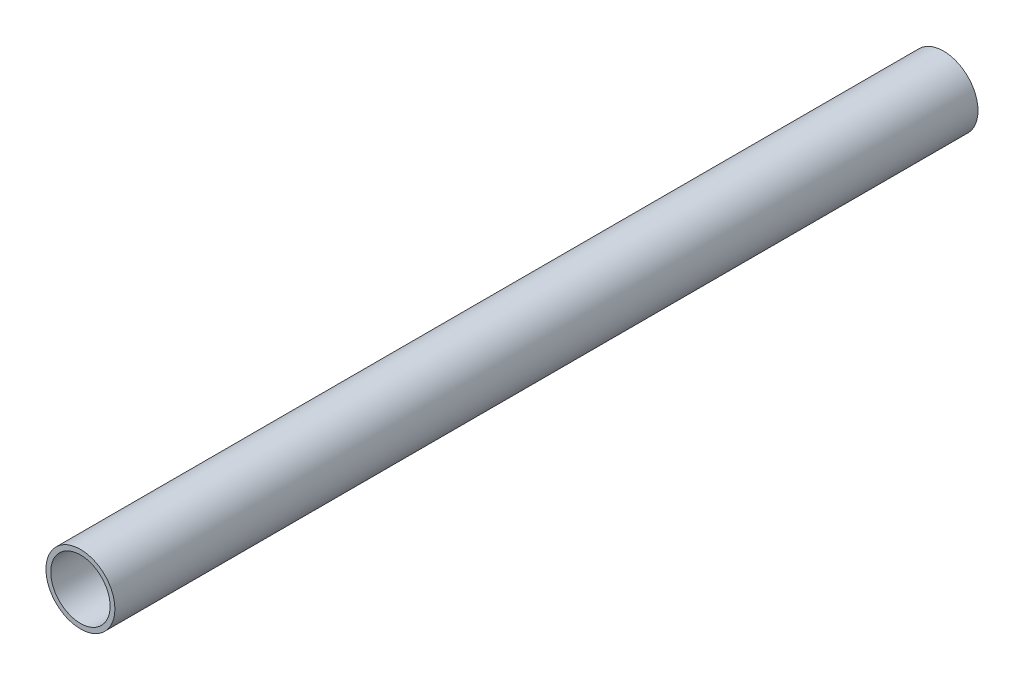
ISO-10303-21;
HEADER;
FILE_DESCRIPTION(('STEP AP214'),'2;1');
FILE_NAME('part.step','',(''),(''),'','','');
FILE_SCHEMA(('AUTOMOTIVE_DESIGN { 1 0 10303 214 1 1 1 1 }'));
ENDSEC;
DATA;
#1=APPLICATION_CONTEXT('core data for automotive mechanical design processes');
#2=APPLICATION_PROTOCOL_DEFINITION('international standard','automotive_design',2000,#1);
#3=PRODUCT_CONTEXT('',#1,'mechanical');
#4=PRODUCT('Part','Part','',(#3));
#5=PRODUCT_RELATED_PRODUCT_CATEGORY('part','',(#4));
#6=PRODUCT_DEFINITION_FORMATION('','',#4);
#7=PRODUCT_DEFINITION_CONTEXT('part definition',#1,'design');
#8=PRODUCT_DEFINITION('design','',#6,#7);
#9=PRODUCT_DEFINITION_SHAPE('','',#8);
#10=(LENGTH_UNIT() NAMED_UNIT(*) SI_UNIT(.MILLI.,.METRE.));
#11=(NAMED_UNIT(*) PLANE_ANGLE_UNIT() SI_UNIT($,.RADIAN.));
#12=(NAMED_UNIT(*) SI_UNIT($,.STERADIAN.) SOLID_ANGLE_UNIT());
#13=UNCERTAINTY_MEASURE_WITH_UNIT(LENGTH_MEASURE(1.E-05),#10,'distance_accuracy_value','');
#14=(GEOMETRIC_REPRESENTATION_CONTEXT(3) GLOBAL_UNCERTAINTY_ASSIGNED_CONTEXT((#13)) GLOBAL_UNIT_ASSIGNED_CONTEXT((#10,
#11,#12)) REPRESENTATION_CONTEXT('',''));
#15=CARTESIAN_POINT('',(0.,0.,0.));
#16=DIRECTION('',(0.,0.,1.));
#17=DIRECTION('',(1.,0.,0.));
#18=AXIS2_PLACEMENT_3D('',#15,#16,#17);
#19=CARTESIAN_POINT('',(0.,0.,189.));
#20=DIRECTION('',(0.,0.,1.));
#21=DIRECTION('',(1.,0.,0.));
#22=AXIS2_PLACEMENT_3D('',#19,#20,#21);
#23=PLANE('',#22);
#24=CARTESIAN_POINT('',(0.,0.,189.));
#25=DIRECTION('',(0.,0.,1.));
#26=DIRECTION('',(1.,0.,0.));
#27=AXIS2_PLACEMENT_3D('',#24,#25,#26);
#28=CIRCLE('',#27,7.55);
#29=CARTESIAN_POINT('',(7.55,0.,189.));
#30=VERTEX_POINT('',#29);
#31=EDGE_CURVE('E10',#30,#30,#28,.T.);
#32=ORIENTED_EDGE('',*,*,#31,.T.);
#33=EDGE_LOOP('',(#32));
#34=FACE_BOUND('',#33,.T.);
#35=CARTESIAN_POINT('',(0.,0.,189.));
#36=DIRECTION('',(0.,0.,1.));
#37=DIRECTION('',(1.,0.,0.));
#38=AXIS2_PLACEMENT_3D('',#35,#36,#37);
#39=CIRCLE('',#38,6.5);
#40=CARTESIAN_POINT('',(6.5,0.,189.));
#41=VERTEX_POINT('',#40);
#42=EDGE_CURVE('E44',#41,#41,#39,.T.);
#43=ORIENTED_EDGE('',*,*,#42,.F.);
#44=EDGE_LOOP('',(#43));
#45=FACE_BOUND('',#44,.T.);
#46=ADVANCED_FACE('F33',(#34,#45),#23,.T.);
#47=CARTESIAN_POINT('',(0.,0.,0.));
#48=DIRECTION('',(0.,0.,1.));
#49=DIRECTION('',(1.,0.,0.));
#50=AXIS2_PLACEMENT_3D('',#47,#48,#49);
#51=PLANE('',#50);
#52=CARTESIAN_POINT('',(0.,0.,0.));
#53=DIRECTION('',(0.,0.,1.));
#54=DIRECTION('',(1.,0.,0.));
#55=AXIS2_PLACEMENT_3D('',#52,#53,#54);
#56=CIRCLE('',#55,7.55);
#57=CARTESIAN_POINT('',(7.55,0.,0.));
#58=VERTEX_POINT('',#57);
#59=EDGE_CURVE('E37',#58,#58,#56,.T.);
#60=ORIENTED_EDGE('',*,*,#59,.F.);
#61=EDGE_LOOP('',(#60));
#62=FACE_BOUND('',#61,.T.);
#63=CARTESIAN_POINT('',(0.,0.,0.));
#64=DIRECTION('',(0.,0.,1.));
#65=DIRECTION('',(1.,0.,0.));
#66=AXIS2_PLACEMENT_3D('',#63,#64,#65);
#67=CIRCLE('',#66,6.5);
#68=CARTESIAN_POINT('',(6.5,0.,0.));
#69=VERTEX_POINT('',#68);
#70=EDGE_CURVE('E46',#69,#69,#67,.T.);
#71=ORIENTED_EDGE('',*,*,#70,.T.);
#72=EDGE_LOOP('',(#71));
#73=FACE_BOUND('',#72,.T.);
#74=ADVANCED_FACE('F56',(#62,#73),#51,.F.);
#75=CARTESIAN_POINT('',(0.,0.,189.));
#76=DIRECTION('',(0.,0.,-1.));
#77=DIRECTION('',(-1.,0.,0.));
#78=AXIS2_PLACEMENT_3D('',#75,#76,#77);
#79=CYLINDRICAL_SURFACE('',#78,7.55);
#80=ORIENTED_EDGE('',*,*,#31,.F.);
#81=EDGE_LOOP('',(#80));
#82=FACE_BOUND('',#81,.T.);
#83=ORIENTED_EDGE('',*,*,#59,.T.);
#84=EDGE_LOOP('',(#83));
#85=FACE_BOUND('',#84,.T.);
#86=ADVANCED_FACE('F35',(#82,#85),#79,.T.);
#87=CARTESIAN_POINT('',(0.,0.,189.));
#88=DIRECTION('',(0.,0.,-1.));
#89=DIRECTION('',(-1.,0.,0.));
#90=AXIS2_PLACEMENT_3D('',#87,#88,#89);
#91=CYLINDRICAL_SURFACE('',#90,6.5);
#92=ORIENTED_EDGE('',*,*,#42,.T.);
#93=EDGE_LOOP('',(#92));
#94=FACE_BOUND('',#93,.T.);
#95=ORIENTED_EDGE('',*,*,#70,.F.);
#96=EDGE_LOOP('',(#95));
#97=FACE_BOUND('',#96,.T.);
#98=ADVANCED_FACE('F52',(#94,#97),#91,.F.);
#99=CLOSED_SHELL('',(#46,#74,#86,#98));
#100=MANIFOLD_SOLID_BREP('B2',#99);
#101=ADVANCED_BREP_SHAPE_REPRESENTATION('',(#18,#100),#14);
#102=SHAPE_DEFINITION_REPRESENTATION(#9,#101);
ENDSEC;
END-ISO-10303-21;
